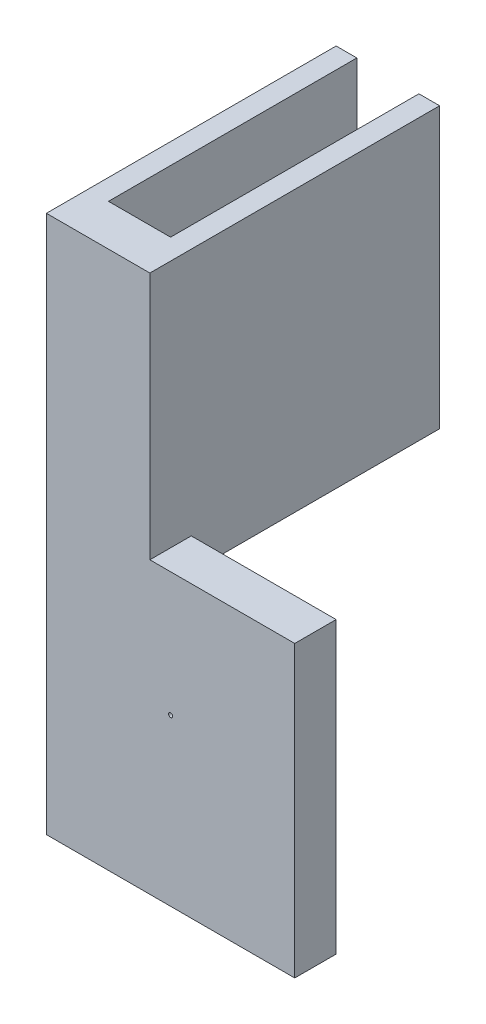
ISO-10303-21;
HEADER;
FILE_DESCRIPTION(('STEP AP214'),'2;1');
FILE_NAME('part.step','',(''),(''),'','','');
FILE_SCHEMA(('AUTOMOTIVE_DESIGN { 1 0 10303 214 1 1 1 1 }'));
ENDSEC;
DATA;
#1=APPLICATION_CONTEXT('core data for automotive mechanical design processes');
#2=APPLICATION_PROTOCOL_DEFINITION('international standard','automotive_design',2000,#1);
#3=PRODUCT_CONTEXT('',#1,'mechanical');
#4=PRODUCT('Part','Part','',(#3));
#5=PRODUCT_RELATED_PRODUCT_CATEGORY('part','',(#4));
#6=PRODUCT_DEFINITION_FORMATION('','',#4);
#7=PRODUCT_DEFINITION_CONTEXT('part definition',#1,'design');
#8=PRODUCT_DEFINITION('design','',#6,#7);
#9=PRODUCT_DEFINITION_SHAPE('','',#8);
#10=(LENGTH_UNIT() NAMED_UNIT(*) SI_UNIT(.MILLI.,.METRE.));
#11=(NAMED_UNIT(*) PLANE_ANGLE_UNIT() SI_UNIT($,.RADIAN.));
#12=(NAMED_UNIT(*) SI_UNIT($,.STERADIAN.) SOLID_ANGLE_UNIT());
#13=UNCERTAINTY_MEASURE_WITH_UNIT(LENGTH_MEASURE(1.E-05),#10,'distance_accuracy_value','');
#14=(GEOMETRIC_REPRESENTATION_CONTEXT(3) GLOBAL_UNCERTAINTY_ASSIGNED_CONTEXT((#13)) GLOBAL_UNIT_ASSIGNED_CONTEXT((#10,
#11,#12)) REPRESENTATION_CONTEXT('',''));
#15=CARTESIAN_POINT('',(0.,0.,0.));
#16=DIRECTION('',(0.,0.,1.));
#17=DIRECTION('',(1.,0.,0.));
#18=AXIS2_PLACEMENT_3D('',#15,#16,#17);
#19=CARTESIAN_POINT('',(-34.3168257694892,-37.145652173913,0.));
#20=DIRECTION('',(0.,0.,1.));
#21=DIRECTION('',(1.,0.,0.));
#22=AXIS2_PLACEMENT_3D('',#19,#20,#21);
#23=PLANE('',#22);
#24=CARTESIAN_POINT('',(-4.31682576948916,2.85434782608696,0.));
#25=DIRECTION('',(0.,0.,-1.));
#26=DIRECTION('',(-1.,0.,0.));
#27=AXIS2_PLACEMENT_3D('',#24,#25,#26);
#28=CIRCLE('',#27,0.500000000000001);
#29=CARTESIAN_POINT('',(-4.81682576948916,2.85434782608696,0.));
#30=VERTEX_POINT('',#29);
#31=EDGE_CURVE('E219',#30,#30,#28,.T.);
#32=ORIENTED_EDGE('',*,*,#31,.F.);
#33=EDGE_LOOP('',(#32));
#34=FACE_BOUND('',#33,.T.);
#35=DIRECTION('',(0.,-1.,0.));
#36=VECTOR('',#35,1.);
#37=CARTESIAN_POINT('',(-29.3168257694892,92.854347826087,0.));
#38=LINE('',#37,#36);
#39=CARTESIAN_POINT('',(-29.3168257694892,92.854347826087,0.));
#40=VERTEX_POINT('',#39);
#41=CARTESIAN_POINT('',(-29.3168257694892,25.271005401186,0.));
#42=VERTEX_POINT('',#41);
#43=EDGE_CURVE('E170',#40,#42,#38,.T.);
#44=ORIENTED_EDGE('',*,*,#43,.F.);
#45=DIRECTION('',(-1.,0.,0.));
#46=VECTOR('',#45,1.);
#47=CARTESIAN_POINT('',(-34.3168257694892,92.854347826087,0.));
#48=LINE('',#47,#46);
#49=CARTESIAN_POINT('',(-14.3168257694892,92.854347826087,0.));
#50=VERTEX_POINT('',#49);
#51=EDGE_CURVE('E53',#50,#40,#48,.T.);
#52=ORIENTED_EDGE('',*,*,#51,.F.);
#53=DIRECTION('',(0.,1.,0.));
#54=VECTOR('',#53,1.);
#55=CARTESIAN_POINT('',(-14.3168257694892,92.854347826087,0.));
#56=LINE('',#55,#54);
#57=CARTESIAN_POINT('',(-14.3168257694892,23.5666630032949,0.));
#58=VERTEX_POINT('',#57);
#59=EDGE_CURVE('E190',#58,#50,#56,.T.);
#60=ORIENTED_EDGE('',*,*,#59,.F.);
#61=DIRECTION('',(-0.946521927524314,-0.322639490322647,0.));
#62=VECTOR('',#61,1.);
#63=CARTESIAN_POINT('',(-9.31682576948917,25.271005401186,0.));
#64=LINE('',#63,#62);
#65=CARTESIAN_POINT('',(-9.31682576948917,25.271005401186,0.));
#66=VERTEX_POINT('',#65);
#67=EDGE_CURVE('E48',#66,#58,#64,.T.);
#68=ORIENTED_EDGE('',*,*,#67,.F.);
#69=DIRECTION('',(0.,-1.,0.));
#70=VECTOR('',#69,1.);
#71=CARTESIAN_POINT('',(-9.31682576948916,92.854347826087,0.));
#72=LINE('',#71,#70);
#73=CARTESIAN_POINT('',(-9.31682576948916,32.854347826087,0.));
#74=VERTEX_POINT('',#73);
#75=EDGE_CURVE('E11',#74,#66,#72,.T.);
#76=ORIENTED_EDGE('',*,*,#75,.F.);
#77=DIRECTION('',(-1.,0.,0.));
#78=VECTOR('',#77,1.);
#79=CARTESIAN_POINT('',(-34.3168257694892,32.854347826087,0.));
#80=LINE('',#79,#78);
#81=CARTESIAN_POINT('',(25.6831742305108,32.854347826087,0.));
#82=VERTEX_POINT('',#81);
#83=EDGE_CURVE('E251',#82,#74,#80,.T.);
#84=ORIENTED_EDGE('',*,*,#83,.F.);
#85=DIRECTION('',(0.,1.,0.));
#86=VECTOR('',#85,1.);
#87=CARTESIAN_POINT('',(25.6831742305108,32.854347826087,0.));
#88=LINE('',#87,#86);
#89=CARTESIAN_POINT('',(25.6831742305108,-37.145652173913,0.));
#90=VERTEX_POINT('',#89);
#91=EDGE_CURVE('E259',#90,#82,#88,.T.);
#92=ORIENTED_EDGE('',*,*,#91,.F.);
#93=DIRECTION('',(1.,0.,0.));
#94=VECTOR('',#93,1.);
#95=CARTESIAN_POINT('',(-34.3168257694892,-37.145652173913,0.));
#96=LINE('',#95,#94);
#97=CARTESIAN_POINT('',(-34.3168257694892,-37.145652173913,0.));
#98=VERTEX_POINT('',#97);
#99=EDGE_CURVE('E262',#98,#90,#96,.T.);
#100=ORIENTED_EDGE('',*,*,#99,.F.);
#101=DIRECTION('',(0.,-1.,0.));
#102=VECTOR('',#101,1.);
#103=CARTESIAN_POINT('',(-34.3168257694892,32.854347826087,0.));
#104=LINE('',#103,#102);
#105=CARTESIAN_POINT('',(-34.3168257694892,25.271005401186,0.));
#106=VERTEX_POINT('',#105);
#107=EDGE_CURVE('E280',#106,#98,#104,.T.);
#108=ORIENTED_EDGE('',*,*,#107,.F.);
#109=DIRECTION('',(-0.334515132266196,0.942390378922095,0.));
#110=VECTOR('',#109,1.);
#111=CARTESIAN_POINT('',(-29.4003494724265,11.4203914419244,0.));
#112=LINE('',#111,#110);
#113=CARTESIAN_POINT('',(-29.4003494724265,11.4203914419244,0.));
#114=VERTEX_POINT('',#113);
#115=EDGE_CURVE('E158',#114,#106,#112,.T.);
#116=ORIENTED_EDGE('',*,*,#115,.F.);
#117=DIRECTION('',(-0.942390378922094,-0.334515132266197,0.));
#118=VECTOR('',#117,1.);
#119=CARTESIAN_POINT('',(-24.9598513410018,12.996610653182,0.));
#120=LINE('',#119,#118);
#121=CARTESIAN_POINT('',(-24.9598513410018,12.996610653182,0.));
#122=VERTEX_POINT('',#121);
#123=EDGE_CURVE('E160',#122,#114,#120,.T.);
#124=ORIENTED_EDGE('',*,*,#123,.F.);
#125=DIRECTION('',(0.334515132266197,-0.942390378922095,0.));
#126=VECTOR('',#125,1.);
#127=CARTESIAN_POINT('',(-29.3168257694892,25.271005401186,0.));
#128=LINE('',#127,#126);
#129=EDGE_CURVE('E172',#42,#122,#128,.T.);
#130=ORIENTED_EDGE('',*,*,#129,.F.);
#131=EDGE_LOOP('',(#44,#52,#60,#68,#76,#84,#92,#100,#108,#116,#124,#130));
#132=FACE_BOUND('',#131,.T.);
#133=ADVANCED_FACE('F31',(#34,#132),#23,.F.);
#134=CARTESIAN_POINT('',(-34.3168257694892,32.854347826087,10.));
#135=DIRECTION('',(0.,-1.,0.));
#136=DIRECTION('',(0.,0.,-1.));
#137=AXIS2_PLACEMENT_3D('',#134,#135,#136);
#138=PLANE('',#137);
#139=DIRECTION('',(0.,0.,-1.));
#140=VECTOR('',#139,1.);
#141=CARTESIAN_POINT('',(-9.31682576948916,32.854347826087,0.));
#142=LINE('',#141,#140);
#143=CARTESIAN_POINT('',(-9.31682576948916,32.854347826087,10.));
#144=VERTEX_POINT('',#143);
#145=EDGE_CURVE('E144',#144,#74,#142,.T.);
#146=ORIENTED_EDGE('',*,*,#145,.F.);
#147=DIRECTION('',(-1.,0.,0.));
#148=VECTOR('',#147,1.);
#149=CARTESIAN_POINT('',(-34.3168257694892,32.854347826087,10.));
#150=LINE('',#149,#148);
#151=CARTESIAN_POINT('',(25.6831742305108,32.854347826087,10.));
#152=VERTEX_POINT('',#151);
#153=EDGE_CURVE('E225',#152,#144,#150,.T.);
#154=ORIENTED_EDGE('',*,*,#153,.F.);
#155=DIRECTION('',(0.,0.,-1.));
#156=VECTOR('',#155,1.);
#157=CARTESIAN_POINT('',(25.6831742305108,32.854347826087,10.));
#158=LINE('',#157,#156);
#159=EDGE_CURVE('E258',#152,#82,#158,.T.);
#160=ORIENTED_EDGE('',*,*,#159,.T.);
#161=ORIENTED_EDGE('',*,*,#83,.T.);
#162=EDGE_LOOP('',(#146,#154,#160,#161));
#163=FACE_BOUND('',#162,.T.);
#164=ADVANCED_FACE('F254',(#163),#138,.F.);
#165=CARTESIAN_POINT('',(-34.3168257694892,32.854347826087,10.));
#166=DIRECTION('',(1.,0.,0.));
#167=DIRECTION('',(0.,1.,0.));
#168=AXIS2_PLACEMENT_3D('',#165,#166,#167);
#169=PLANE('',#168);
#170=DIRECTION('',(0.,0.,1.));
#171=VECTOR('',#170,1.);
#172=CARTESIAN_POINT('',(-34.3168257694892,92.854347826087,0.));
#173=LINE('',#172,#171);
#174=CARTESIAN_POINT('',(-34.3168257694892,92.854347826087,-60.));
#175=VERTEX_POINT('',#174);
#176=CARTESIAN_POINT('',(-34.3168257694892,92.854347826087,10.));
#177=VERTEX_POINT('',#176);
#178=EDGE_CURVE('E133',#175,#177,#173,.T.);
#179=ORIENTED_EDGE('',*,*,#178,.F.);
#180=DIRECTION('',(0.,1.,0.));
#181=VECTOR('',#180,1.);
#182=CARTESIAN_POINT('',(-34.3168257694892,92.854347826087,-60.));
#183=LINE('',#182,#181);
#184=CARTESIAN_POINT('',(-34.3168257694892,25.271005401186,-60.));
#185=VERTEX_POINT('',#184);
#186=EDGE_CURVE('E137',#185,#175,#183,.T.);
#187=ORIENTED_EDGE('',*,*,#186,.F.);
#188=DIRECTION('',(0.,0.,1.));
#189=VECTOR('',#188,1.);
#190=CARTESIAN_POINT('',(-34.3168257694892,25.271005401186,-60.));
#191=LINE('',#190,#189);
#192=EDGE_CURVE('E169',#185,#106,#191,.T.);
#193=ORIENTED_EDGE('',*,*,#192,.T.);
#194=ORIENTED_EDGE('',*,*,#107,.T.);
#195=DIRECTION('',(0.,0.,-1.));
#196=VECTOR('',#195,1.);
#197=CARTESIAN_POINT('',(-34.3168257694892,-37.145652173913,10.));
#198=LINE('',#197,#196);
#199=CARTESIAN_POINT('',(-34.3168257694892,-37.145652173913,10.));
#200=VERTEX_POINT('',#199);
#201=EDGE_CURVE('E40',#200,#98,#198,.T.);
#202=ORIENTED_EDGE('',*,*,#201,.F.);
#203=DIRECTION('',(0.,-1.,0.));
#204=VECTOR('',#203,1.);
#205=CARTESIAN_POINT('',(-34.3168257694892,32.854347826087,10.));
#206=LINE('',#205,#204);
#207=EDGE_CURVE('E140',#177,#200,#206,.T.);
#208=ORIENTED_EDGE('',*,*,#207,.F.);
#209=EDGE_LOOP('',(#179,#187,#193,#194,#202,#208));
#210=FACE_BOUND('',#209,.T.);
#211=ADVANCED_FACE('F33',(#210),#169,.F.);
#212=CARTESIAN_POINT('',(-34.3168257694892,-37.145652173913,10.));
#213=DIRECTION('',(0.,1.,0.));
#214=DIRECTION('',(0.,0.,1.));
#215=AXIS2_PLACEMENT_3D('',#212,#213,#214);
#216=PLANE('',#215);
#217=ORIENTED_EDGE('',*,*,#99,.T.);
#218=DIRECTION('',(0.,0.,-1.));
#219=VECTOR('',#218,1.);
#220=CARTESIAN_POINT('',(25.6831742305108,-37.145652173913,10.));
#221=LINE('',#220,#219);
#222=CARTESIAN_POINT('',(25.6831742305108,-37.145652173913,10.));
#223=VERTEX_POINT('',#222);
#224=EDGE_CURVE('E270',#223,#90,#221,.T.);
#225=ORIENTED_EDGE('',*,*,#224,.F.);
#226=DIRECTION('',(1.,0.,0.));
#227=VECTOR('',#226,1.);
#228=CARTESIAN_POINT('',(-34.3168257694892,-37.145652173913,10.));
#229=LINE('',#228,#227);
#230=EDGE_CURVE('E260',#200,#223,#229,.T.);
#231=ORIENTED_EDGE('',*,*,#230,.F.);
#232=ORIENTED_EDGE('',*,*,#201,.T.);
#233=EDGE_LOOP('',(#217,#225,#231,#232));
#234=FACE_BOUND('',#233,.T.);
#235=ADVANCED_FACE('F277',(#234),#216,.F.);
#236=CARTESIAN_POINT('',(25.6831742305108,32.854347826087,10.));
#237=DIRECTION('',(-1.,0.,0.));
#238=DIRECTION('',(0.,-1.,0.));
#239=AXIS2_PLACEMENT_3D('',#236,#237,#238);
#240=PLANE('',#239);
#241=ORIENTED_EDGE('',*,*,#91,.T.);
#242=ORIENTED_EDGE('',*,*,#159,.F.);
#243=DIRECTION('',(0.,1.,0.));
#244=VECTOR('',#243,1.);
#245=CARTESIAN_POINT('',(25.6831742305108,32.854347826087,10.));
#246=LINE('',#245,#244);
#247=EDGE_CURVE('E285',#223,#152,#246,.T.);
#248=ORIENTED_EDGE('',*,*,#247,.F.);
#249=ORIENTED_EDGE('',*,*,#224,.T.);
#250=EDGE_LOOP('',(#241,#242,#248,#249));
#251=FACE_BOUND('',#250,.T.);
#252=ADVANCED_FACE('F289',(#251),#240,.F.);
#253=CARTESIAN_POINT('',(-34.3168257694892,-37.145652173913,10.));
#254=DIRECTION('',(0.,0.,1.));
#255=DIRECTION('',(1.,0.,0.));
#256=AXIS2_PLACEMENT_3D('',#253,#254,#255);
#257=PLANE('',#256);
#258=CARTESIAN_POINT('',(-4.31682576948916,2.85434782608696,10.));
#259=DIRECTION('',(0.,0.,1.));
#260=DIRECTION('',(1.,0.,0.));
#261=AXIS2_PLACEMENT_3D('',#258,#259,#260);
#262=CIRCLE('',#261,0.500000000000001);
#263=CARTESIAN_POINT('',(-3.81682576948916,2.85434782608696,10.));
#264=VERTEX_POINT('',#263);
#265=EDGE_CURVE('E230',#264,#264,#262,.F.);
#266=ORIENTED_EDGE('',*,*,#265,.T.);
#267=EDGE_LOOP('',(#266));
#268=FACE_BOUND('',#267,.T.);
#269=ORIENTED_EDGE('',*,*,#207,.T.);
#270=ORIENTED_EDGE('',*,*,#230,.T.);
#271=ORIENTED_EDGE('',*,*,#247,.T.);
#272=ORIENTED_EDGE('',*,*,#153,.T.);
#273=DIRECTION('',(0.,-1.,0.));
#274=VECTOR('',#273,1.);
#275=CARTESIAN_POINT('',(-9.31682576948916,92.854347826087,10.));
#276=LINE('',#275,#274);
#277=CARTESIAN_POINT('',(-9.31682576948916,92.854347826087,10.));
#278=VERTEX_POINT('',#277);
#279=EDGE_CURVE('E228',#278,#144,#276,.T.);
#280=ORIENTED_EDGE('',*,*,#279,.F.);
#281=DIRECTION('',(1.,0.,0.));
#282=VECTOR('',#281,1.);
#283=CARTESIAN_POINT('',(-34.3168257694892,92.854347826087,10.));
#284=LINE('',#283,#282);
#285=EDGE_CURVE('E143',#177,#278,#284,.T.);
#286=ORIENTED_EDGE('',*,*,#285,.F.);
#287=EDGE_LOOP('',(#269,#270,#271,#272,#280,#286));
#288=FACE_BOUND('',#287,.T.);
#289=ADVANCED_FACE('F288',(#268,#288),#257,.T.);
#290=CARTESIAN_POINT('',(-4.31682576948916,2.85434782608696,10.001));
#291=DIRECTION('',(0.,0.,-1.));
#292=DIRECTION('',(-1.,0.,0.));
#293=AXIS2_PLACEMENT_3D('',#290,#291,#292);
#294=CYLINDRICAL_SURFACE('',#293,0.500000000000001);
#295=ORIENTED_EDGE('',*,*,#265,.F.);
#296=EDGE_LOOP('',(#295));
#297=FACE_BOUND('',#296,.T.);
#298=ORIENTED_EDGE('',*,*,#31,.T.);
#299=EDGE_LOOP('',(#298));
#300=FACE_BOUND('',#299,.T.);
#301=ADVANCED_FACE('F342',(#297,#300),#294,.F.);
#302=CARTESIAN_POINT('',(-9.31682576948916,92.854347826087,0.));
#303=DIRECTION('',(-1.,0.,0.));
#304=DIRECTION('',(0.,0.,1.));
#305=AXIS2_PLACEMENT_3D('',#302,#303,#304);
#306=PLANE('',#305);
#307=ORIENTED_EDGE('',*,*,#145,.T.);
#308=ORIENTED_EDGE('',*,*,#75,.T.);
#309=DIRECTION('',(0.,0.,1.));
#310=VECTOR('',#309,1.);
#311=CARTESIAN_POINT('',(-9.31682576948917,25.271005401186,-60.));
#312=LINE('',#311,#310);
#313=CARTESIAN_POINT('',(-9.31682576948917,25.271005401186,-60.));
#314=VERTEX_POINT('',#313);
#315=EDGE_CURVE('E210',#314,#66,#312,.T.);
#316=ORIENTED_EDGE('',*,*,#315,.F.);
#317=DIRECTION('',(0.,-1.,0.));
#318=VECTOR('',#317,1.);
#319=CARTESIAN_POINT('',(-9.31682576948916,92.854347826087,-60.));
#320=LINE('',#319,#318);
#321=CARTESIAN_POINT('',(-9.31682576948916,92.854347826087,-60.));
#322=VERTEX_POINT('',#321);
#323=EDGE_CURVE('E186',#322,#314,#320,.T.);
#324=ORIENTED_EDGE('',*,*,#323,.F.);
#325=DIRECTION('',(0.,0.,-1.));
#326=VECTOR('',#325,1.);
#327=CARTESIAN_POINT('',(-9.31682576948916,92.854347826087,0.));
#328=LINE('',#327,#326);
#329=EDGE_CURVE('E214',#278,#322,#328,.T.);
#330=ORIENTED_EDGE('',*,*,#329,.F.);
#331=ORIENTED_EDGE('',*,*,#279,.T.);
#332=EDGE_LOOP('',(#307,#308,#316,#324,#330,#331));
#333=FACE_BOUND('',#332,.T.);
#334=ADVANCED_FACE('F247',(#333),#306,.F.);
#335=CARTESIAN_POINT('',(-34.3168257694892,92.854347826087,10.));
#336=DIRECTION('',(0.,1.,0.));
#337=DIRECTION('',(0.,0.,1.));
#338=AXIS2_PLACEMENT_3D('',#335,#336,#337);
#339=PLANE('',#338);
#340=ORIENTED_EDGE('',*,*,#178,.T.);
#341=ORIENTED_EDGE('',*,*,#285,.T.);
#342=ORIENTED_EDGE('',*,*,#329,.T.);
#343=DIRECTION('',(1.,0.,0.));
#344=VECTOR('',#343,1.);
#345=CARTESIAN_POINT('',(-9.31682576948916,92.854347826087,-60.));
#346=LINE('',#345,#344);
#347=CARTESIAN_POINT('',(-14.3168257694892,92.854347826087,-60.));
#348=VERTEX_POINT('',#347);
#349=EDGE_CURVE('E194',#348,#322,#346,.T.);
#350=ORIENTED_EDGE('',*,*,#349,.F.);
#351=DIRECTION('',(0.,0.,1.));
#352=VECTOR('',#351,1.);
#353=CARTESIAN_POINT('',(-14.3168257694892,92.854347826087,-60.));
#354=LINE('',#353,#352);
#355=EDGE_CURVE('E197',#348,#50,#354,.T.);
#356=ORIENTED_EDGE('',*,*,#355,.T.);
#357=ORIENTED_EDGE('',*,*,#51,.T.);
#358=DIRECTION('',(0.,0.,1.));
#359=VECTOR('',#358,1.);
#360=CARTESIAN_POINT('',(-29.3168257694892,92.854347826087,-60.));
#361=LINE('',#360,#359);
#362=CARTESIAN_POINT('',(-29.3168257694892,92.854347826087,-60.));
#363=VERTEX_POINT('',#362);
#364=EDGE_CURVE('E149',#363,#40,#361,.T.);
#365=ORIENTED_EDGE('',*,*,#364,.F.);
#366=DIRECTION('',(1.,0.,0.));
#367=VECTOR('',#366,1.);
#368=CARTESIAN_POINT('',(-34.3168257694892,92.854347826087,-60.));
#369=LINE('',#368,#367);
#370=EDGE_CURVE('E147',#175,#363,#369,.T.);
#371=ORIENTED_EDGE('',*,*,#370,.F.);
#372=EDGE_LOOP('',(#340,#341,#342,#350,#356,#357,#365,#371));
#373=FACE_BOUND('',#372,.T.);
#374=ADVANCED_FACE('F148',(#373),#339,.T.);
#375=CARTESIAN_POINT('',(-9.31682576948917,25.271005401186,-60.));
#376=DIRECTION('',(-0.322639490322647,0.946521927524314,0.));
#377=DIRECTION('',(-0.946521927524314,-0.322639490322647,0.));
#378=AXIS2_PLACEMENT_3D('',#375,#376,#377);
#379=PLANE('',#378);
#380=ORIENTED_EDGE('',*,*,#67,.T.);
#381=DIRECTION('',(0.,0.,1.));
#382=VECTOR('',#381,1.);
#383=CARTESIAN_POINT('',(-14.3168257694892,23.5666630032949,-60.));
#384=LINE('',#383,#382);
#385=CARTESIAN_POINT('',(-14.3168257694892,23.5666630032949,-60.));
#386=VERTEX_POINT('',#385);
#387=EDGE_CURVE('E207',#386,#58,#384,.T.);
#388=ORIENTED_EDGE('',*,*,#387,.F.);
#389=DIRECTION('',(-0.946521927524314,-0.322639490322647,0.));
#390=VECTOR('',#389,1.);
#391=CARTESIAN_POINT('',(-9.31682576948917,25.271005401186,-60.));
#392=LINE('',#391,#390);
#393=EDGE_CURVE('E189',#314,#386,#392,.T.);
#394=ORIENTED_EDGE('',*,*,#393,.F.);
#395=ORIENTED_EDGE('',*,*,#315,.T.);
#396=EDGE_LOOP('',(#380,#388,#394,#395));
#397=FACE_BOUND('',#396,.T.);
#398=ADVANCED_FACE('F244',(#397),#379,.F.);
#399=CARTESIAN_POINT('',(-14.3168257694892,92.854347826087,-60.));
#400=DIRECTION('',(1.,0.,0.));
#401=DIRECTION('',(0.,1.,0.));
#402=AXIS2_PLACEMENT_3D('',#399,#400,#401);
#403=PLANE('',#402);
#404=ORIENTED_EDGE('',*,*,#59,.T.);
#405=ORIENTED_EDGE('',*,*,#355,.F.);
#406=DIRECTION('',(0.,1.,0.));
#407=VECTOR('',#406,1.);
#408=CARTESIAN_POINT('',(-14.3168257694892,92.854347826087,-60.));
#409=LINE('',#408,#407);
#410=EDGE_CURVE('E192',#386,#348,#409,.T.);
#411=ORIENTED_EDGE('',*,*,#410,.F.);
#412=ORIENTED_EDGE('',*,*,#387,.T.);
#413=EDGE_LOOP('',(#404,#405,#411,#412));
#414=FACE_BOUND('',#413,.T.);
#415=ADVANCED_FACE('F241',(#414),#403,.F.);
#416=CARTESIAN_POINT('',(-9.31682576948916,92.854347826087,-60.));
#417=DIRECTION('',(0.,0.,-1.));
#418=DIRECTION('',(-1.,0.,0.));
#419=AXIS2_PLACEMENT_3D('',#416,#417,#418);
#420=PLANE('',#419);
#421=ORIENTED_EDGE('',*,*,#323,.T.);
#422=ORIENTED_EDGE('',*,*,#393,.T.);
#423=ORIENTED_EDGE('',*,*,#410,.T.);
#424=ORIENTED_EDGE('',*,*,#349,.T.);
#425=EDGE_LOOP('',(#421,#422,#423,#424));
#426=FACE_BOUND('',#425,.T.);
#427=ADVANCED_FACE('F291',(#426),#420,.T.);
#428=CARTESIAN_POINT('',(-29.3168257694892,92.854347826087,-60.));
#429=DIRECTION('',(-1.,0.,0.));
#430=DIRECTION('',(0.,-1.,0.));
#431=AXIS2_PLACEMENT_3D('',#428,#429,#430);
#432=PLANE('',#431);
#433=ORIENTED_EDGE('',*,*,#43,.T.);
#434=DIRECTION('',(0.,0.,1.));
#435=VECTOR('',#434,1.);
#436=CARTESIAN_POINT('',(-29.3168257694892,25.271005401186,-60.));
#437=LINE('',#436,#435);
#438=CARTESIAN_POINT('',(-29.3168257694892,25.271005401186,-60.));
#439=VERTEX_POINT('',#438);
#440=EDGE_CURVE('E182',#439,#42,#437,.T.);
#441=ORIENTED_EDGE('',*,*,#440,.F.);
#442=DIRECTION('',(0.,-1.,0.));
#443=VECTOR('',#442,1.);
#444=CARTESIAN_POINT('',(-29.3168257694892,92.854347826087,-60.));
#445=LINE('',#444,#443);
#446=EDGE_CURVE('E152',#363,#439,#445,.T.);
#447=ORIENTED_EDGE('',*,*,#446,.F.);
#448=ORIENTED_EDGE('',*,*,#364,.T.);
#449=EDGE_LOOP('',(#433,#441,#447,#448));
#450=FACE_BOUND('',#449,.T.);
#451=ADVANCED_FACE('F293',(#450),#432,.F.);
#452=CARTESIAN_POINT('',(-29.3168257694892,25.271005401186,-60.));
#453=DIRECTION('',(-0.942390378922095,-0.334515132266197,0.));
#454=DIRECTION('',(0.334515132266197,-0.942390378922095,0.));
#455=AXIS2_PLACEMENT_3D('',#452,#453,#454);
#456=PLANE('',#455);
#457=ORIENTED_EDGE('',*,*,#129,.T.);
#458=DIRECTION('',(0.,0.,1.));
#459=VECTOR('',#458,1.);
#460=CARTESIAN_POINT('',(-24.9598513410018,12.996610653182,-60.));
#461=LINE('',#460,#459);
#462=CARTESIAN_POINT('',(-24.9598513410018,12.996610653182,-60.));
#463=VERTEX_POINT('',#462);
#464=EDGE_CURVE('E179',#463,#122,#461,.T.);
#465=ORIENTED_EDGE('',*,*,#464,.F.);
#466=DIRECTION('',(0.334515132266197,-0.942390378922095,0.));
#467=VECTOR('',#466,1.);
#468=CARTESIAN_POINT('',(-29.3168257694892,25.271005401186,-60.));
#469=LINE('',#468,#467);
#470=EDGE_CURVE('E164',#439,#463,#469,.T.);
#471=ORIENTED_EDGE('',*,*,#470,.F.);
#472=ORIENTED_EDGE('',*,*,#440,.T.);
#473=EDGE_LOOP('',(#457,#465,#471,#472));
#474=FACE_BOUND('',#473,.T.);
#475=ADVANCED_FACE('F299',(#474),#456,.F.);
#476=CARTESIAN_POINT('',(-24.9598513410018,12.996610653182,-60.));
#477=DIRECTION('',(-0.334515132266197,0.942390378922094,0.));
#478=DIRECTION('',(-0.942390378922095,-0.334515132266197,0.));
#479=AXIS2_PLACEMENT_3D('',#476,#477,#478);
#480=PLANE('',#479);
#481=ORIENTED_EDGE('',*,*,#123,.T.);
#482=DIRECTION('',(0.,0.,1.));
#483=VECTOR('',#482,1.);
#484=CARTESIAN_POINT('',(-29.4003494724265,11.4203914419244,-60.));
#485=LINE('',#484,#483);
#486=CARTESIAN_POINT('',(-29.4003494724265,11.4203914419244,-60.));
#487=VERTEX_POINT('',#486);
#488=EDGE_CURVE('E176',#487,#114,#485,.T.);
#489=ORIENTED_EDGE('',*,*,#488,.F.);
#490=DIRECTION('',(-0.942390378922094,-0.334515132266197,0.));
#491=VECTOR('',#490,1.);
#492=CARTESIAN_POINT('',(-24.9598513410018,12.996610653182,-60.));
#493=LINE('',#492,#491);
#494=EDGE_CURVE('E166',#463,#487,#493,.T.);
#495=ORIENTED_EDGE('',*,*,#494,.F.);
#496=ORIENTED_EDGE('',*,*,#464,.T.);
#497=EDGE_LOOP('',(#481,#489,#495,#496));
#498=FACE_BOUND('',#497,.T.);
#499=ADVANCED_FACE('F420',(#498),#480,.F.);
#500=CARTESIAN_POINT('',(-29.4003494724265,11.4203914419244,-60.));
#501=DIRECTION('',(0.942390378922095,0.334515132266196,0.));
#502=DIRECTION('',(-0.334515132266196,0.942390378922095,0.));
#503=AXIS2_PLACEMENT_3D('',#500,#501,#502);
#504=PLANE('',#503);
#505=ORIENTED_EDGE('',*,*,#115,.T.);
#506=ORIENTED_EDGE('',*,*,#192,.F.);
#507=DIRECTION('',(-0.334515132266196,0.942390378922095,0.));
#508=VECTOR('',#507,1.);
#509=CARTESIAN_POINT('',(-29.4003494724265,11.4203914419244,-60.));
#510=LINE('',#509,#508);
#511=EDGE_CURVE('E156',#487,#185,#510,.T.);
#512=ORIENTED_EDGE('',*,*,#511,.F.);
#513=ORIENTED_EDGE('',*,*,#488,.T.);
#514=EDGE_LOOP('',(#505,#506,#512,#513));
#515=FACE_BOUND('',#514,.T.);
#516=ADVANCED_FACE('F429',(#515),#504,.F.);
#517=CARTESIAN_POINT('',(-34.3168257694892,92.854347826087,-60.));
#518=DIRECTION('',(0.,0.,1.));
#519=DIRECTION('',(1.,0.,0.));
#520=AXIS2_PLACEMENT_3D('',#517,#518,#519);
#521=PLANE('',#520);
#522=ORIENTED_EDGE('',*,*,#186,.T.);
#523=ORIENTED_EDGE('',*,*,#370,.T.);
#524=ORIENTED_EDGE('',*,*,#446,.T.);
#525=ORIENTED_EDGE('',*,*,#470,.T.);
#526=ORIENTED_EDGE('',*,*,#494,.T.);
#527=ORIENTED_EDGE('',*,*,#511,.T.);
#528=EDGE_LOOP('',(#522,#523,#524,#525,#526,#527));
#529=FACE_BOUND('',#528,.T.);
#530=ADVANCED_FACE('F154',(#529),#521,.F.);
#531=CLOSED_SHELL('',(#133,#164,#211,#235,#252,#289,#301,#334,#374,#398,#415,#427,#451,#475,
#499,#516,#530));
#532=MANIFOLD_SOLID_BREP('B2',#531);
#533=ADVANCED_BREP_SHAPE_REPRESENTATION('',(#18,#532),#14);
#534=SHAPE_DEFINITION_REPRESENTATION(#9,#533);
ENDSEC;
END-ISO-10303-21;
